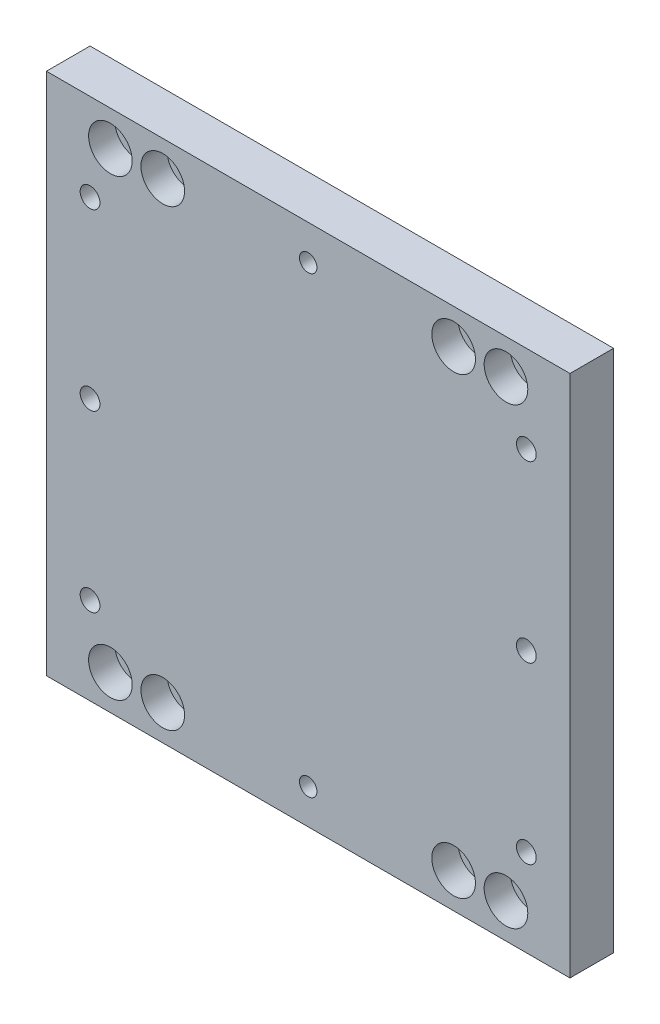
ISO-10303-21;
HEADER;
FILE_DESCRIPTION(('STEP AP214'),'2;1');
FILE_NAME('part.step','',(''),(''),'','','');
FILE_SCHEMA(('AUTOMOTIVE_DESIGN { 1 0 10303 214 1 1 1 1 }'));
ENDSEC;
DATA;
#1=APPLICATION_CONTEXT('core data for automotive mechanical design processes');
#2=APPLICATION_PROTOCOL_DEFINITION('international standard','automotive_design',2000,#1);
#3=PRODUCT_CONTEXT('',#1,'mechanical');
#4=PRODUCT('Part','Part','',(#3));
#5=PRODUCT_RELATED_PRODUCT_CATEGORY('part','',(#4));
#6=PRODUCT_DEFINITION_FORMATION('','',#4);
#7=PRODUCT_DEFINITION_CONTEXT('part definition',#1,'design');
#8=PRODUCT_DEFINITION('design','',#6,#7);
#9=PRODUCT_DEFINITION_SHAPE('','',#8);
#10=(LENGTH_UNIT() NAMED_UNIT(*) SI_UNIT(.MILLI.,.METRE.));
#11=(NAMED_UNIT(*) PLANE_ANGLE_UNIT() SI_UNIT($,.RADIAN.));
#12=(NAMED_UNIT(*) SI_UNIT($,.STERADIAN.) SOLID_ANGLE_UNIT());
#13=UNCERTAINTY_MEASURE_WITH_UNIT(LENGTH_MEASURE(1.E-05),#10,'distance_accuracy_value','');
#14=(GEOMETRIC_REPRESENTATION_CONTEXT(3) GLOBAL_UNCERTAINTY_ASSIGNED_CONTEXT((#13)) GLOBAL_UNIT_ASSIGNED_CONTEXT((#10,
#11,#12)) REPRESENTATION_CONTEXT('',''));
#15=CARTESIAN_POINT('',(0.,0.,0.));
#16=DIRECTION('',(0.,0.,1.));
#17=DIRECTION('',(1.,0.,0.));
#18=AXIS2_PLACEMENT_3D('',#15,#16,#17);
#19=CARTESIAN_POINT('',(-90.,90.,15.));
#20=DIRECTION('',(1.,0.,0.));
#21=DIRECTION('',(0.,1.,0.));
#22=AXIS2_PLACEMENT_3D('',#19,#20,#21);
#23=PLANE('',#22);
#24=DIRECTION('',(0.,-1.,0.));
#25=VECTOR('',#24,1.);
#26=CARTESIAN_POINT('',(-90.,90.,0.));
#27=LINE('',#26,#25);
#28=CARTESIAN_POINT('',(-90.,90.,0.));
#29=VERTEX_POINT('',#28);
#30=CARTESIAN_POINT('',(-90.,-90.,0.));
#31=VERTEX_POINT('',#30);
#32=EDGE_CURVE('E102',#29,#31,#27,.T.);
#33=ORIENTED_EDGE('',*,*,#32,.T.);
#34=DIRECTION('',(0.,0.,-1.));
#35=VECTOR('',#34,1.);
#36=CARTESIAN_POINT('',(-90.,-90.,15.));
#37=LINE('',#36,#35);
#38=CARTESIAN_POINT('',(-90.,-90.,15.));
#39=VERTEX_POINT('',#38);
#40=EDGE_CURVE('E11',#39,#31,#37,.T.);
#41=ORIENTED_EDGE('',*,*,#40,.F.);
#42=DIRECTION('',(0.,-1.,0.));
#43=VECTOR('',#42,1.);
#44=CARTESIAN_POINT('',(-90.,90.,15.));
#45=LINE('',#44,#43);
#46=CARTESIAN_POINT('',(-90.,90.,15.));
#47=VERTEX_POINT('',#46);
#48=EDGE_CURVE('E89',#47,#39,#45,.T.);
#49=ORIENTED_EDGE('',*,*,#48,.F.);
#50=DIRECTION('',(0.,0.,-1.));
#51=VECTOR('',#50,1.);
#52=CARTESIAN_POINT('',(-90.,90.,15.));
#53=LINE('',#52,#51);
#54=EDGE_CURVE('E98',#47,#29,#53,.T.);
#55=ORIENTED_EDGE('',*,*,#54,.T.);
#56=EDGE_LOOP('',(#33,#41,#49,#55));
#57=FACE_BOUND('',#56,.T.);
#58=ADVANCED_FACE('F36',(#57),#23,.F.);
#59=CARTESIAN_POINT('',(-90.,-90.,15.));
#60=DIRECTION('',(0.,1.,0.));
#61=DIRECTION('',(0.,0.,1.));
#62=AXIS2_PLACEMENT_3D('',#59,#60,#61);
#63=PLANE('',#62);
#64=DIRECTION('',(1.,0.,0.));
#65=VECTOR('',#64,1.);
#66=CARTESIAN_POINT('',(-90.,-90.,0.));
#67=LINE('',#66,#65);
#68=CARTESIAN_POINT('',(90.,-90.,0.));
#69=VERTEX_POINT('',#68);
#70=EDGE_CURVE('E93',#31,#69,#67,.T.);
#71=ORIENTED_EDGE('',*,*,#70,.T.);
#72=DIRECTION('',(0.,0.,-1.));
#73=VECTOR('',#72,1.);
#74=CARTESIAN_POINT('',(90.,-90.,15.));
#75=LINE('',#74,#73);
#76=CARTESIAN_POINT('',(90.,-90.,15.));
#77=VERTEX_POINT('',#76);
#78=EDGE_CURVE('E45',#77,#69,#75,.T.);
#79=ORIENTED_EDGE('',*,*,#78,.F.);
#80=DIRECTION('',(1.,0.,0.));
#81=VECTOR('',#80,1.);
#82=CARTESIAN_POINT('',(-90.,-90.,15.));
#83=LINE('',#82,#81);
#84=EDGE_CURVE('E84',#39,#77,#83,.T.);
#85=ORIENTED_EDGE('',*,*,#84,.F.);
#86=ORIENTED_EDGE('',*,*,#40,.T.);
#87=EDGE_LOOP('',(#71,#79,#85,#86));
#88=FACE_BOUND('',#87,.T.);
#89=ADVANCED_FACE('F92',(#88),#63,.F.);
#90=CARTESIAN_POINT('',(90.,90.,15.));
#91=DIRECTION('',(-1.,0.,0.));
#92=DIRECTION('',(0.,-1.,0.));
#93=AXIS2_PLACEMENT_3D('',#90,#91,#92);
#94=PLANE('',#93);
#95=DIRECTION('',(0.,1.,0.));
#96=VECTOR('',#95,1.);
#97=CARTESIAN_POINT('',(90.,90.,0.));
#98=LINE('',#97,#96);
#99=CARTESIAN_POINT('',(90.,90.,0.));
#100=VERTEX_POINT('',#99);
#101=EDGE_CURVE('E71',#69,#100,#98,.T.);
#102=ORIENTED_EDGE('',*,*,#101,.T.);
#103=DIRECTION('',(0.,0.,-1.));
#104=VECTOR('',#103,1.);
#105=CARTESIAN_POINT('',(90.,90.,15.));
#106=LINE('',#105,#104);
#107=CARTESIAN_POINT('',(90.,90.,15.));
#108=VERTEX_POINT('',#107);
#109=EDGE_CURVE('E94',#108,#100,#106,.T.);
#110=ORIENTED_EDGE('',*,*,#109,.F.);
#111=DIRECTION('',(0.,1.,0.));
#112=VECTOR('',#111,1.);
#113=CARTESIAN_POINT('',(90.,90.,15.));
#114=LINE('',#113,#112);
#115=EDGE_CURVE('E87',#77,#108,#114,.T.);
#116=ORIENTED_EDGE('',*,*,#115,.F.);
#117=ORIENTED_EDGE('',*,*,#78,.T.);
#118=EDGE_LOOP('',(#102,#110,#116,#117));
#119=FACE_BOUND('',#118,.T.);
#120=ADVANCED_FACE('F96',(#119),#94,.F.);
#121=CARTESIAN_POINT('',(-90.,90.,15.));
#122=DIRECTION('',(0.,-1.,0.));
#123=DIRECTION('',(1.,0.,0.));
#124=AXIS2_PLACEMENT_3D('',#121,#122,#123);
#125=PLANE('',#124);
#126=DIRECTION('',(-1.,0.,0.));
#127=VECTOR('',#126,1.);
#128=CARTESIAN_POINT('',(-90.,90.,0.));
#129=LINE('',#128,#127);
#130=EDGE_CURVE('E77',#100,#29,#129,.T.);
#131=ORIENTED_EDGE('',*,*,#130,.T.);
#132=ORIENTED_EDGE('',*,*,#54,.F.);
#133=DIRECTION('',(-1.,0.,0.));
#134=VECTOR('',#133,1.);
#135=CARTESIAN_POINT('',(-90.,90.,15.));
#136=LINE('',#135,#134);
#137=EDGE_CURVE('E54',#108,#47,#136,.T.);
#138=ORIENTED_EDGE('',*,*,#137,.F.);
#139=ORIENTED_EDGE('',*,*,#109,.T.);
#140=EDGE_LOOP('',(#131,#132,#138,#139));
#141=FACE_BOUND('',#140,.T.);
#142=ADVANCED_FACE('F267',(#141),#125,.F.);
#143=CARTESIAN_POINT('',(0.,0.,15.));
#144=DIRECTION('',(0.,0.,1.));
#145=DIRECTION('',(1.,0.,0.));
#146=AXIS2_PLACEMENT_3D('',#143,#144,#145);
#147=PLANE('',#146);
#148=CARTESIAN_POINT('',(-75.,60.,15.));
#149=DIRECTION('',(0.,0.,1.));
#150=DIRECTION('',(1.,0.,0.));
#151=AXIS2_PLACEMENT_3D('',#148,#149,#150);
#152=CIRCLE('',#151,3.39999999999999);
#153=CARTESIAN_POINT('',(-71.6,60.,15.));
#154=VERTEX_POINT('',#153);
#155=EDGE_CURVE('E629',#154,#154,#152,.T.);
#156=ORIENTED_EDGE('',*,*,#155,.F.);
#157=EDGE_LOOP('',(#156));
#158=FACE_BOUND('',#157,.T.);
#159=CARTESIAN_POINT('',(-75.,0.,15.));
#160=DIRECTION('',(0.,0.,1.));
#161=DIRECTION('',(1.,0.,0.));
#162=AXIS2_PLACEMENT_3D('',#159,#160,#161);
#163=CIRCLE('',#162,3.39999999999999);
#164=CARTESIAN_POINT('',(-71.6,0.,15.));
#165=VERTEX_POINT('',#164);
#166=EDGE_CURVE('E633',#165,#165,#163,.T.);
#167=ORIENTED_EDGE('',*,*,#166,.F.);
#168=EDGE_LOOP('',(#167));
#169=FACE_BOUND('',#168,.T.);
#170=CARTESIAN_POINT('',(-75.,-60.,15.));
#171=DIRECTION('',(0.,0.,1.));
#172=DIRECTION('',(1.,0.,0.));
#173=AXIS2_PLACEMENT_3D('',#170,#171,#172);
#174=CIRCLE('',#173,3.39999999999999);
#175=CARTESIAN_POINT('',(-71.6,-60.,15.));
#176=VERTEX_POINT('',#175);
#177=EDGE_CURVE('E131',#176,#176,#174,.T.);
#178=ORIENTED_EDGE('',*,*,#177,.F.);
#179=EDGE_LOOP('',(#178));
#180=FACE_BOUND('',#179,.T.);
#181=CARTESIAN_POINT('',(75.,-60.,15.));
#182=DIRECTION('',(0.,0.,1.));
#183=DIRECTION('',(1.,0.,0.));
#184=AXIS2_PLACEMENT_3D('',#181,#182,#183);
#185=CIRCLE('',#184,3.39999999999999);
#186=CARTESIAN_POINT('',(78.4,-60.,15.));
#187=VERTEX_POINT('',#186);
#188=EDGE_CURVE('E121',#187,#187,#185,.T.);
#189=ORIENTED_EDGE('',*,*,#188,.F.);
#190=EDGE_LOOP('',(#189));
#191=FACE_BOUND('',#190,.T.);
#192=CARTESIAN_POINT('',(75.,0.,15.));
#193=DIRECTION('',(0.,0.,1.));
#194=DIRECTION('',(1.,0.,0.));
#195=AXIS2_PLACEMENT_3D('',#192,#193,#194);
#196=CIRCLE('',#195,3.39999999999999);
#197=CARTESIAN_POINT('',(78.4,0.,15.));
#198=VERTEX_POINT('',#197);
#199=EDGE_CURVE('E118',#198,#198,#196,.T.);
#200=ORIENTED_EDGE('',*,*,#199,.F.);
#201=EDGE_LOOP('',(#200));
#202=FACE_BOUND('',#201,.T.);
#203=CARTESIAN_POINT('',(75.,60.,15.));
#204=DIRECTION('',(0.,0.,1.));
#205=DIRECTION('',(1.,0.,0.));
#206=AXIS2_PLACEMENT_3D('',#203,#204,#205);
#207=CIRCLE('',#206,3.39999999999999);
#208=CARTESIAN_POINT('',(78.4,60.,15.));
#209=VERTEX_POINT('',#208);
#210=EDGE_CURVE('E115',#209,#209,#207,.T.);
#211=ORIENTED_EDGE('',*,*,#210,.F.);
#212=EDGE_LOOP('',(#211));
#213=FACE_BOUND('',#212,.T.);
#214=CARTESIAN_POINT('',(0.,78.,15.));
#215=DIRECTION('',(0.,0.,1.));
#216=DIRECTION('',(1.,0.,0.));
#217=AXIS2_PLACEMENT_3D('',#214,#215,#216);
#218=CIRCLE('',#217,2.99999999999999);
#219=CARTESIAN_POINT('',(2.99999999999999,78.,15.));
#220=VERTEX_POINT('',#219);
#221=EDGE_CURVE('E114',#220,#220,#218,.T.);
#222=ORIENTED_EDGE('',*,*,#221,.F.);
#223=EDGE_LOOP('',(#222));
#224=FACE_BOUND('',#223,.T.);
#225=CARTESIAN_POINT('',(0.,-78.,15.));
#226=DIRECTION('',(0.,0.,1.));
#227=DIRECTION('',(1.,0.,0.));
#228=AXIS2_PLACEMENT_3D('',#225,#226,#227);
#229=CIRCLE('',#228,2.99999999999999);
#230=CARTESIAN_POINT('',(3.,-78.,15.));
#231=VERTEX_POINT('',#230);
#232=EDGE_CURVE('E142',#231,#231,#229,.T.);
#233=ORIENTED_EDGE('',*,*,#232,.F.);
#234=EDGE_LOOP('',(#233));
#235=FACE_BOUND('',#234,.T.);
#236=CARTESIAN_POINT('',(-68.,-78.,15.));
#237=DIRECTION('',(0.,0.,1.));
#238=DIRECTION('',(1.,0.,0.));
#239=AXIS2_PLACEMENT_3D('',#236,#237,#238);
#240=CIRCLE('',#239,7.5);
#241=CARTESIAN_POINT('',(-60.5,-78.,15.));
#242=VERTEX_POINT('',#241);
#243=EDGE_CURVE('E148',#242,#242,#240,.T.);
#244=ORIENTED_EDGE('',*,*,#243,.F.);
#245=EDGE_LOOP('',(#244));
#246=FACE_BOUND('',#245,.T.);
#247=CARTESIAN_POINT('',(-50.,-78.,15.));
#248=DIRECTION('',(0.,0.,1.));
#249=DIRECTION('',(1.,0.,0.));
#250=AXIS2_PLACEMENT_3D('',#247,#248,#249);
#251=CIRCLE('',#250,7.5);
#252=CARTESIAN_POINT('',(-42.5,-78.,15.));
#253=VERTEX_POINT('',#252);
#254=EDGE_CURVE('E160',#253,#253,#251,.T.);
#255=ORIENTED_EDGE('',*,*,#254,.F.);
#256=EDGE_LOOP('',(#255));
#257=FACE_BOUND('',#256,.T.);
#258=CARTESIAN_POINT('',(50.,-78.,15.));
#259=DIRECTION('',(0.,0.,1.));
#260=DIRECTION('',(1.,0.,0.));
#261=AXIS2_PLACEMENT_3D('',#258,#259,#260);
#262=CIRCLE('',#261,7.5);
#263=CARTESIAN_POINT('',(57.5,-78.,15.));
#264=VERTEX_POINT('',#263);
#265=EDGE_CURVE('E172',#264,#264,#262,.T.);
#266=ORIENTED_EDGE('',*,*,#265,.F.);
#267=EDGE_LOOP('',(#266));
#268=FACE_BOUND('',#267,.T.);
#269=CARTESIAN_POINT('',(68.,-78.,15.));
#270=DIRECTION('',(0.,0.,1.));
#271=DIRECTION('',(1.,0.,0.));
#272=AXIS2_PLACEMENT_3D('',#269,#270,#271);
#273=CIRCLE('',#272,7.49999999999999);
#274=CARTESIAN_POINT('',(75.5,-78.,15.));
#275=VERTEX_POINT('',#274);
#276=EDGE_CURVE('E184',#275,#275,#273,.T.);
#277=ORIENTED_EDGE('',*,*,#276,.F.);
#278=EDGE_LOOP('',(#277));
#279=FACE_BOUND('',#278,.T.);
#280=CARTESIAN_POINT('',(68.,78.,15.));
#281=DIRECTION('',(0.,0.,1.));
#282=DIRECTION('',(1.,0.,0.));
#283=AXIS2_PLACEMENT_3D('',#280,#281,#282);
#284=CIRCLE('',#283,7.49999999999999);
#285=CARTESIAN_POINT('',(75.5,78.,15.));
#286=VERTEX_POINT('',#285);
#287=EDGE_CURVE('E196',#286,#286,#284,.T.);
#288=ORIENTED_EDGE('',*,*,#287,.F.);
#289=EDGE_LOOP('',(#288));
#290=FACE_BOUND('',#289,.T.);
#291=CARTESIAN_POINT('',(50.,78.,15.));
#292=DIRECTION('',(0.,0.,1.));
#293=DIRECTION('',(1.,0.,0.));
#294=AXIS2_PLACEMENT_3D('',#291,#292,#293);
#295=CIRCLE('',#294,7.5);
#296=CARTESIAN_POINT('',(57.5,78.,15.));
#297=VERTEX_POINT('',#296);
#298=EDGE_CURVE('E208',#297,#297,#295,.T.);
#299=ORIENTED_EDGE('',*,*,#298,.F.);
#300=EDGE_LOOP('',(#299));
#301=FACE_BOUND('',#300,.T.);
#302=CARTESIAN_POINT('',(-50.,78.,15.));
#303=DIRECTION('',(0.,0.,1.));
#304=DIRECTION('',(1.,0.,0.));
#305=AXIS2_PLACEMENT_3D('',#302,#303,#304);
#306=CIRCLE('',#305,7.5);
#307=CARTESIAN_POINT('',(-42.5,78.,15.));
#308=VERTEX_POINT('',#307);
#309=EDGE_CURVE('E220',#308,#308,#306,.T.);
#310=ORIENTED_EDGE('',*,*,#309,.F.);
#311=EDGE_LOOP('',(#310));
#312=FACE_BOUND('',#311,.T.);
#313=CARTESIAN_POINT('',(-68.,78.,15.));
#314=DIRECTION('',(0.,0.,1.));
#315=DIRECTION('',(1.,0.,0.));
#316=AXIS2_PLACEMENT_3D('',#313,#314,#315);
#317=CIRCLE('',#316,7.5);
#318=CARTESIAN_POINT('',(-60.5,78.,15.));
#319=VERTEX_POINT('',#318);
#320=EDGE_CURVE('E232',#319,#319,#317,.T.);
#321=ORIENTED_EDGE('',*,*,#320,.F.);
#322=EDGE_LOOP('',(#321));
#323=FACE_BOUND('',#322,.T.);
#324=ORIENTED_EDGE('',*,*,#48,.T.);
#325=ORIENTED_EDGE('',*,*,#84,.T.);
#326=ORIENTED_EDGE('',*,*,#115,.T.);
#327=ORIENTED_EDGE('',*,*,#137,.T.);
#328=EDGE_LOOP('',(#324,#325,#326,#327));
#329=FACE_BOUND('',#328,.T.);
#330=ADVANCED_FACE('F85',(#158,#169,#180,#191,#202,#213,#224,#235,#246,#257,#268,#279,#290,#301,
#312,#323,#329),#147,.T.);
#331=CARTESIAN_POINT('',(0.,0.,0.));
#332=DIRECTION('',(0.,0.,1.));
#333=DIRECTION('',(1.,0.,0.));
#334=AXIS2_PLACEMENT_3D('',#331,#332,#333);
#335=PLANE('',#334);
#336=CARTESIAN_POINT('',(-75.,60.,0.));
#337=DIRECTION('',(0.,0.,1.));
#338=DIRECTION('',(1.,0.,0.));
#339=AXIS2_PLACEMENT_3D('',#336,#337,#338);
#340=CIRCLE('',#339,3.39999999999999);
#341=CARTESIAN_POINT('',(-71.6,60.,0.));
#342=VERTEX_POINT('',#341);
#343=EDGE_CURVE('E632',#342,#342,#340,.T.);
#344=ORIENTED_EDGE('',*,*,#343,.T.);
#345=EDGE_LOOP('',(#344));
#346=FACE_BOUND('',#345,.T.);
#347=CARTESIAN_POINT('',(-75.,0.,0.));
#348=DIRECTION('',(0.,0.,1.));
#349=DIRECTION('',(1.,0.,0.));
#350=AXIS2_PLACEMENT_3D('',#347,#348,#349);
#351=CIRCLE('',#350,3.39999999999999);
#352=CARTESIAN_POINT('',(-71.6,0.,0.));
#353=VERTEX_POINT('',#352);
#354=EDGE_CURVE('E636',#353,#353,#351,.T.);
#355=ORIENTED_EDGE('',*,*,#354,.T.);
#356=EDGE_LOOP('',(#355));
#357=FACE_BOUND('',#356,.T.);
#358=CARTESIAN_POINT('',(-75.,-60.,0.));
#359=DIRECTION('',(0.,0.,1.));
#360=DIRECTION('',(1.,0.,0.));
#361=AXIS2_PLACEMENT_3D('',#358,#359,#360);
#362=CIRCLE('',#361,3.39999999999999);
#363=CARTESIAN_POINT('',(-71.6,-60.,0.));
#364=VERTEX_POINT('',#363);
#365=EDGE_CURVE('E39',#364,#364,#362,.T.);
#366=ORIENTED_EDGE('',*,*,#365,.T.);
#367=EDGE_LOOP('',(#366));
#368=FACE_BOUND('',#367,.T.);
#369=CARTESIAN_POINT('',(75.,-60.,0.));
#370=DIRECTION('',(0.,0.,1.));
#371=DIRECTION('',(1.,0.,0.));
#372=AXIS2_PLACEMENT_3D('',#369,#370,#371);
#373=CIRCLE('',#372,3.39999999999999);
#374=CARTESIAN_POINT('',(78.4,-60.,0.));
#375=VERTEX_POINT('',#374);
#376=EDGE_CURVE('E119',#375,#375,#373,.T.);
#377=ORIENTED_EDGE('',*,*,#376,.T.);
#378=EDGE_LOOP('',(#377));
#379=FACE_BOUND('',#378,.T.);
#380=CARTESIAN_POINT('',(75.,0.,0.));
#381=DIRECTION('',(0.,0.,1.));
#382=DIRECTION('',(1.,0.,0.));
#383=AXIS2_PLACEMENT_3D('',#380,#381,#382);
#384=CIRCLE('',#383,3.39999999999999);
#385=CARTESIAN_POINT('',(78.4,0.,0.));
#386=VERTEX_POINT('',#385);
#387=EDGE_CURVE('E116',#386,#386,#384,.T.);
#388=ORIENTED_EDGE('',*,*,#387,.T.);
#389=EDGE_LOOP('',(#388));
#390=FACE_BOUND('',#389,.T.);
#391=CARTESIAN_POINT('',(75.,60.,0.));
#392=DIRECTION('',(0.,0.,1.));
#393=DIRECTION('',(1.,0.,0.));
#394=AXIS2_PLACEMENT_3D('',#391,#392,#393);
#395=CIRCLE('',#394,3.39999999999999);
#396=CARTESIAN_POINT('',(78.4,60.,0.));
#397=VERTEX_POINT('',#396);
#398=EDGE_CURVE('E111',#397,#397,#395,.T.);
#399=ORIENTED_EDGE('',*,*,#398,.T.);
#400=EDGE_LOOP('',(#399));
#401=FACE_BOUND('',#400,.T.);
#402=CARTESIAN_POINT('',(0.,78.,0.));
#403=DIRECTION('',(0.,0.,1.));
#404=DIRECTION('',(1.,0.,0.));
#405=AXIS2_PLACEMENT_3D('',#402,#403,#404);
#406=CIRCLE('',#405,3.);
#407=CARTESIAN_POINT('',(3.,78.,0.));
#408=VERTEX_POINT('',#407);
#409=EDGE_CURVE('E139',#408,#408,#406,.T.);
#410=ORIENTED_EDGE('',*,*,#409,.T.);
#411=EDGE_LOOP('',(#410));
#412=FACE_BOUND('',#411,.T.);
#413=CARTESIAN_POINT('',(0.,-78.,0.));
#414=DIRECTION('',(0.,0.,1.));
#415=DIRECTION('',(1.,0.,0.));
#416=AXIS2_PLACEMENT_3D('',#413,#414,#415);
#417=CIRCLE('',#416,3.);
#418=CARTESIAN_POINT('',(3.00000000000001,-78.,0.));
#419=VERTEX_POINT('',#418);
#420=EDGE_CURVE('E145',#419,#419,#417,.T.);
#421=ORIENTED_EDGE('',*,*,#420,.T.);
#422=EDGE_LOOP('',(#421));
#423=FACE_BOUND('',#422,.T.);
#424=CARTESIAN_POINT('',(-68.,-78.,0.));
#425=DIRECTION('',(0.,0.,1.));
#426=DIRECTION('',(1.,0.,0.));
#427=AXIS2_PLACEMENT_3D('',#424,#425,#426);
#428=CIRCLE('',#427,4.5);
#429=CARTESIAN_POINT('',(-63.5,-78.,0.));
#430=VERTEX_POINT('',#429);
#431=EDGE_CURVE('E157',#430,#430,#428,.T.);
#432=ORIENTED_EDGE('',*,*,#431,.T.);
#433=EDGE_LOOP('',(#432));
#434=FACE_BOUND('',#433,.T.);
#435=CARTESIAN_POINT('',(-50.,-78.,0.));
#436=DIRECTION('',(0.,0.,1.));
#437=DIRECTION('',(1.,0.,0.));
#438=AXIS2_PLACEMENT_3D('',#435,#436,#437);
#439=CIRCLE('',#438,4.5);
#440=CARTESIAN_POINT('',(-45.5,-78.,0.));
#441=VERTEX_POINT('',#440);
#442=EDGE_CURVE('E169',#441,#441,#439,.T.);
#443=ORIENTED_EDGE('',*,*,#442,.T.);
#444=EDGE_LOOP('',(#443));
#445=FACE_BOUND('',#444,.T.);
#446=CARTESIAN_POINT('',(50.,-78.,0.));
#447=DIRECTION('',(0.,0.,1.));
#448=DIRECTION('',(1.,0.,0.));
#449=AXIS2_PLACEMENT_3D('',#446,#447,#448);
#450=CIRCLE('',#449,4.5);
#451=CARTESIAN_POINT('',(54.5,-78.,0.));
#452=VERTEX_POINT('',#451);
#453=EDGE_CURVE('E181',#452,#452,#450,.T.);
#454=ORIENTED_EDGE('',*,*,#453,.T.);
#455=EDGE_LOOP('',(#454));
#456=FACE_BOUND('',#455,.T.);
#457=CARTESIAN_POINT('',(68.,-78.,0.));
#458=DIRECTION('',(0.,0.,1.));
#459=DIRECTION('',(1.,0.,0.));
#460=AXIS2_PLACEMENT_3D('',#457,#458,#459);
#461=CIRCLE('',#460,4.49999999999999);
#462=CARTESIAN_POINT('',(72.5,-78.,0.));
#463=VERTEX_POINT('',#462);
#464=EDGE_CURVE('E193',#463,#463,#461,.T.);
#465=ORIENTED_EDGE('',*,*,#464,.T.);
#466=EDGE_LOOP('',(#465));
#467=FACE_BOUND('',#466,.T.);
#468=CARTESIAN_POINT('',(68.,78.,0.));
#469=DIRECTION('',(0.,0.,1.));
#470=DIRECTION('',(1.,0.,0.));
#471=AXIS2_PLACEMENT_3D('',#468,#469,#470);
#472=CIRCLE('',#471,4.5);
#473=CARTESIAN_POINT('',(72.5,78.,0.));
#474=VERTEX_POINT('',#473);
#475=EDGE_CURVE('E205',#474,#474,#472,.T.);
#476=ORIENTED_EDGE('',*,*,#475,.T.);
#477=EDGE_LOOP('',(#476));
#478=FACE_BOUND('',#477,.T.);
#479=CARTESIAN_POINT('',(50.,78.,0.));
#480=DIRECTION('',(0.,0.,1.));
#481=DIRECTION('',(1.,0.,0.));
#482=AXIS2_PLACEMENT_3D('',#479,#480,#481);
#483=CIRCLE('',#482,4.5);
#484=CARTESIAN_POINT('',(54.5,78.,0.));
#485=VERTEX_POINT('',#484);
#486=EDGE_CURVE('E217',#485,#485,#483,.T.);
#487=ORIENTED_EDGE('',*,*,#486,.T.);
#488=EDGE_LOOP('',(#487));
#489=FACE_BOUND('',#488,.T.);
#490=CARTESIAN_POINT('',(-50.,78.,0.));
#491=DIRECTION('',(0.,0.,1.));
#492=DIRECTION('',(1.,0.,0.));
#493=AXIS2_PLACEMENT_3D('',#490,#491,#492);
#494=CIRCLE('',#493,4.5);
#495=CARTESIAN_POINT('',(-45.5,78.,0.));
#496=VERTEX_POINT('',#495);
#497=EDGE_CURVE('E229',#496,#496,#494,.T.);
#498=ORIENTED_EDGE('',*,*,#497,.T.);
#499=EDGE_LOOP('',(#498));
#500=FACE_BOUND('',#499,.T.);
#501=CARTESIAN_POINT('',(-68.,78.,0.));
#502=DIRECTION('',(0.,0.,1.));
#503=DIRECTION('',(1.,0.,0.));
#504=AXIS2_PLACEMENT_3D('',#501,#502,#503);
#505=CIRCLE('',#504,4.5);
#506=CARTESIAN_POINT('',(-63.5,78.,0.));
#507=VERTEX_POINT('',#506);
#508=EDGE_CURVE('E105',#507,#507,#505,.T.);
#509=ORIENTED_EDGE('',*,*,#508,.T.);
#510=EDGE_LOOP('',(#509));
#511=FACE_BOUND('',#510,.T.);
#512=ORIENTED_EDGE('',*,*,#32,.F.);
#513=ORIENTED_EDGE('',*,*,#130,.F.);
#514=ORIENTED_EDGE('',*,*,#101,.F.);
#515=ORIENTED_EDGE('',*,*,#70,.F.);
#516=EDGE_LOOP('',(#512,#513,#514,#515));
#517=FACE_BOUND('',#516,.T.);
#518=ADVANCED_FACE('F244',(#346,#357,#368,#379,#390,#401,#412,#423,#434,#445,#456,#467,#478,
#489,#500,#511,#517),#335,.F.);
#519=CARTESIAN_POINT('',(-68.,78.,15.));
#520=DIRECTION('',(0.,0.,1.));
#521=DIRECTION('',(1.,0.,0.));
#522=AXIS2_PLACEMENT_3D('',#519,#520,#521);
#523=CYLINDRICAL_SURFACE('',#522,4.5);
#524=ORIENTED_EDGE('',*,*,#508,.F.);
#525=EDGE_LOOP('',(#524));
#526=FACE_BOUND('',#525,.T.);
#527=CARTESIAN_POINT('',(-68.,78.,6.));
#528=DIRECTION('',(0.,0.,1.));
#529=DIRECTION('',(1.,0.,0.));
#530=AXIS2_PLACEMENT_3D('',#527,#528,#529);
#531=CIRCLE('',#530,4.5);
#532=CARTESIAN_POINT('',(-63.5,78.,6.));
#533=VERTEX_POINT('',#532);
#534=EDGE_CURVE('E238',#533,#533,#531,.T.);
#535=ORIENTED_EDGE('',*,*,#534,.T.);
#536=EDGE_LOOP('',(#535));
#537=FACE_BOUND('',#536,.T.);
#538=ADVANCED_FACE('F247',(#526,#537),#523,.F.);
#539=CARTESIAN_POINT('',(-63.5,78.,6.));
#540=DIRECTION('',(0.,0.,-1.));
#541=DIRECTION('',(-1.,0.,0.));
#542=AXIS2_PLACEMENT_3D('',#539,#540,#541);
#543=PLANE('',#542);
#544=ORIENTED_EDGE('',*,*,#534,.F.);
#545=EDGE_LOOP('',(#544));
#546=FACE_BOUND('',#545,.T.);
#547=CARTESIAN_POINT('',(-68.,78.,6.));
#548=DIRECTION('',(0.,0.,1.));
#549=DIRECTION('',(1.,0.,0.));
#550=AXIS2_PLACEMENT_3D('',#547,#548,#549);
#551=CIRCLE('',#550,7.5);
#552=CARTESIAN_POINT('',(-60.5,78.,6.));
#553=VERTEX_POINT('',#552);
#554=EDGE_CURVE('E235',#553,#553,#551,.T.);
#555=ORIENTED_EDGE('',*,*,#554,.T.);
#556=EDGE_LOOP('',(#555));
#557=FACE_BOUND('',#556,.T.);
#558=ADVANCED_FACE('F250',(#546,#557),#543,.F.);
#559=CARTESIAN_POINT('',(-68.,78.,15.));
#560=DIRECTION('',(0.,0.,1.));
#561=DIRECTION('',(1.,0.,0.));
#562=AXIS2_PLACEMENT_3D('',#559,#560,#561);
#563=CYLINDRICAL_SURFACE('',#562,7.5);
#564=ORIENTED_EDGE('',*,*,#554,.F.);
#565=EDGE_LOOP('',(#564));
#566=FACE_BOUND('',#565,.T.);
#567=ORIENTED_EDGE('',*,*,#320,.T.);
#568=EDGE_LOOP('',(#567));
#569=FACE_BOUND('',#568,.T.);
#570=ADVANCED_FACE('F256',(#566,#569),#563,.F.);
#571=CARTESIAN_POINT('',(-50.,78.,15.));
#572=DIRECTION('',(0.,0.,1.));
#573=DIRECTION('',(1.,0.,0.));
#574=AXIS2_PLACEMENT_3D('',#571,#572,#573);
#575=CYLINDRICAL_SURFACE('',#574,4.5);
#576=ORIENTED_EDGE('',*,*,#497,.F.);
#577=EDGE_LOOP('',(#576));
#578=FACE_BOUND('',#577,.T.);
#579=CARTESIAN_POINT('',(-50.,78.,6.));
#580=DIRECTION('',(0.,0.,1.));
#581=DIRECTION('',(1.,0.,0.));
#582=AXIS2_PLACEMENT_3D('',#579,#580,#581);
#583=CIRCLE('',#582,4.5);
#584=CARTESIAN_POINT('',(-45.5,78.,6.));
#585=VERTEX_POINT('',#584);
#586=EDGE_CURVE('E226',#585,#585,#583,.T.);
#587=ORIENTED_EDGE('',*,*,#586,.T.);
#588=EDGE_LOOP('',(#587));
#589=FACE_BOUND('',#588,.T.);
#590=ADVANCED_FACE('F262',(#578,#589),#575,.F.);
#591=CARTESIAN_POINT('',(-45.5,78.,6.));
#592=DIRECTION('',(0.,0.,-1.));
#593=DIRECTION('',(-1.,0.,0.));
#594=AXIS2_PLACEMENT_3D('',#591,#592,#593);
#595=PLANE('',#594);
#596=ORIENTED_EDGE('',*,*,#586,.F.);
#597=EDGE_LOOP('',(#596));
#598=FACE_BOUND('',#597,.T.);
#599=CARTESIAN_POINT('',(-50.,78.,6.));
#600=DIRECTION('',(0.,0.,1.));
#601=DIRECTION('',(1.,0.,0.));
#602=AXIS2_PLACEMENT_3D('',#599,#600,#601);
#603=CIRCLE('',#602,7.5);
#604=CARTESIAN_POINT('',(-42.5,78.,6.));
#605=VERTEX_POINT('',#604);
#606=EDGE_CURVE('E223',#605,#605,#603,.T.);
#607=ORIENTED_EDGE('',*,*,#606,.T.);
#608=EDGE_LOOP('',(#607));
#609=FACE_BOUND('',#608,.T.);
#610=ADVANCED_FACE('F324',(#598,#609),#595,.F.);
#611=CARTESIAN_POINT('',(-50.,78.,15.));
#612=DIRECTION('',(0.,0.,1.));
#613=DIRECTION('',(1.,0.,0.));
#614=AXIS2_PLACEMENT_3D('',#611,#612,#613);
#615=CYLINDRICAL_SURFACE('',#614,7.5);
#616=ORIENTED_EDGE('',*,*,#606,.F.);
#617=EDGE_LOOP('',(#616));
#618=FACE_BOUND('',#617,.T.);
#619=ORIENTED_EDGE('',*,*,#309,.T.);
#620=EDGE_LOOP('',(#619));
#621=FACE_BOUND('',#620,.T.);
#622=ADVANCED_FACE('F334',(#618,#621),#615,.F.);
#623=CARTESIAN_POINT('',(50.,78.,15.));
#624=DIRECTION('',(0.,0.,1.));
#625=DIRECTION('',(1.,0.,0.));
#626=AXIS2_PLACEMENT_3D('',#623,#624,#625);
#627=CYLINDRICAL_SURFACE('',#626,4.5);
#628=ORIENTED_EDGE('',*,*,#486,.F.);
#629=EDGE_LOOP('',(#628));
#630=FACE_BOUND('',#629,.T.);
#631=CARTESIAN_POINT('',(50.,78.,6.));
#632=DIRECTION('',(0.,0.,1.));
#633=DIRECTION('',(1.,0.,0.));
#634=AXIS2_PLACEMENT_3D('',#631,#632,#633);
#635=CIRCLE('',#634,4.5);
#636=CARTESIAN_POINT('',(54.5,78.,6.));
#637=VERTEX_POINT('',#636);
#638=EDGE_CURVE('E214',#637,#637,#635,.T.);
#639=ORIENTED_EDGE('',*,*,#638,.T.);
#640=EDGE_LOOP('',(#639));
#641=FACE_BOUND('',#640,.T.);
#642=ADVANCED_FACE('F344',(#630,#641),#627,.F.);
#643=CARTESIAN_POINT('',(54.5,78.,6.));
#644=DIRECTION('',(0.,0.,-1.));
#645=DIRECTION('',(-1.,0.,0.));
#646=AXIS2_PLACEMENT_3D('',#643,#644,#645);
#647=PLANE('',#646);
#648=ORIENTED_EDGE('',*,*,#638,.F.);
#649=EDGE_LOOP('',(#648));
#650=FACE_BOUND('',#649,.T.);
#651=CARTESIAN_POINT('',(50.,78.,6.));
#652=DIRECTION('',(0.,0.,1.));
#653=DIRECTION('',(1.,0.,0.));
#654=AXIS2_PLACEMENT_3D('',#651,#652,#653);
#655=CIRCLE('',#654,7.5);
#656=CARTESIAN_POINT('',(57.5,78.,6.));
#657=VERTEX_POINT('',#656);
#658=EDGE_CURVE('E211',#657,#657,#655,.T.);
#659=ORIENTED_EDGE('',*,*,#658,.T.);
#660=EDGE_LOOP('',(#659));
#661=FACE_BOUND('',#660,.T.);
#662=ADVANCED_FACE('F354',(#650,#661),#647,.F.);
#663=CARTESIAN_POINT('',(50.,78.,15.));
#664=DIRECTION('',(0.,0.,1.));
#665=DIRECTION('',(1.,0.,0.));
#666=AXIS2_PLACEMENT_3D('',#663,#664,#665);
#667=CYLINDRICAL_SURFACE('',#666,7.5);
#668=ORIENTED_EDGE('',*,*,#658,.F.);
#669=EDGE_LOOP('',(#668));
#670=FACE_BOUND('',#669,.T.);
#671=ORIENTED_EDGE('',*,*,#298,.T.);
#672=EDGE_LOOP('',(#671));
#673=FACE_BOUND('',#672,.T.);
#674=ADVANCED_FACE('F364',(#670,#673),#667,.F.);
#675=CARTESIAN_POINT('',(68.,78.,15.));
#676=DIRECTION('',(0.,0.,1.));
#677=DIRECTION('',(1.,0.,0.));
#678=AXIS2_PLACEMENT_3D('',#675,#676,#677);
#679=CYLINDRICAL_SURFACE('',#678,4.5);
#680=ORIENTED_EDGE('',*,*,#475,.F.);
#681=EDGE_LOOP('',(#680));
#682=FACE_BOUND('',#681,.T.);
#683=CARTESIAN_POINT('',(68.,78.,6.));
#684=DIRECTION('',(0.,0.,1.));
#685=DIRECTION('',(1.,0.,0.));
#686=AXIS2_PLACEMENT_3D('',#683,#684,#685);
#687=CIRCLE('',#686,4.5);
#688=CARTESIAN_POINT('',(72.5,78.,6.));
#689=VERTEX_POINT('',#688);
#690=EDGE_CURVE('E202',#689,#689,#687,.T.);
#691=ORIENTED_EDGE('',*,*,#690,.T.);
#692=EDGE_LOOP('',(#691));
#693=FACE_BOUND('',#692,.T.);
#694=ADVANCED_FACE('F374',(#682,#693),#679,.F.);
#695=CARTESIAN_POINT('',(72.5,78.,6.));
#696=DIRECTION('',(0.,0.,-1.));
#697=DIRECTION('',(-1.,0.,0.));
#698=AXIS2_PLACEMENT_3D('',#695,#696,#697);
#699=PLANE('',#698);
#700=ORIENTED_EDGE('',*,*,#690,.F.);
#701=EDGE_LOOP('',(#700));
#702=FACE_BOUND('',#701,.T.);
#703=CARTESIAN_POINT('',(68.,78.,6.));
#704=DIRECTION('',(0.,0.,1.));
#705=DIRECTION('',(1.,0.,0.));
#706=AXIS2_PLACEMENT_3D('',#703,#704,#705);
#707=CIRCLE('',#706,7.49999999999999);
#708=CARTESIAN_POINT('',(75.5,78.,6.));
#709=VERTEX_POINT('',#708);
#710=EDGE_CURVE('E199',#709,#709,#707,.T.);
#711=ORIENTED_EDGE('',*,*,#710,.T.);
#712=EDGE_LOOP('',(#711));
#713=FACE_BOUND('',#712,.T.);
#714=ADVANCED_FACE('F384',(#702,#713),#699,.F.);
#715=CARTESIAN_POINT('',(68.,78.,15.));
#716=DIRECTION('',(0.,0.,1.));
#717=DIRECTION('',(1.,0.,0.));
#718=AXIS2_PLACEMENT_3D('',#715,#716,#717);
#719=CYLINDRICAL_SURFACE('',#718,7.49999999999999);
#720=ORIENTED_EDGE('',*,*,#710,.F.);
#721=EDGE_LOOP('',(#720));
#722=FACE_BOUND('',#721,.T.);
#723=ORIENTED_EDGE('',*,*,#287,.T.);
#724=EDGE_LOOP('',(#723));
#725=FACE_BOUND('',#724,.T.);
#726=ADVANCED_FACE('F394',(#722,#725),#719,.F.);
#727=CARTESIAN_POINT('',(68.,-78.,15.));
#728=DIRECTION('',(0.,0.,1.));
#729=DIRECTION('',(1.,0.,0.));
#730=AXIS2_PLACEMENT_3D('',#727,#728,#729);
#731=CYLINDRICAL_SURFACE('',#730,4.5);
#732=ORIENTED_EDGE('',*,*,#464,.F.);
#733=EDGE_LOOP('',(#732));
#734=FACE_BOUND('',#733,.T.);
#735=CARTESIAN_POINT('',(68.,-78.,6.));
#736=DIRECTION('',(0.,0.,1.));
#737=DIRECTION('',(1.,0.,0.));
#738=AXIS2_PLACEMENT_3D('',#735,#736,#737);
#739=CIRCLE('',#738,4.5);
#740=CARTESIAN_POINT('',(72.5,-78.,6.));
#741=VERTEX_POINT('',#740);
#742=EDGE_CURVE('E190',#741,#741,#739,.T.);
#743=ORIENTED_EDGE('',*,*,#742,.T.);
#744=EDGE_LOOP('',(#743));
#745=FACE_BOUND('',#744,.T.);
#746=ADVANCED_FACE('F404',(#734,#745),#731,.F.);
#747=CARTESIAN_POINT('',(72.5,-78.,6.));
#748=DIRECTION('',(0.,0.,-1.));
#749=DIRECTION('',(-1.,0.,0.));
#750=AXIS2_PLACEMENT_3D('',#747,#748,#749);
#751=PLANE('',#750);
#752=ORIENTED_EDGE('',*,*,#742,.F.);
#753=EDGE_LOOP('',(#752));
#754=FACE_BOUND('',#753,.T.);
#755=CARTESIAN_POINT('',(68.,-78.,6.));
#756=DIRECTION('',(0.,0.,1.));
#757=DIRECTION('',(1.,0.,0.));
#758=AXIS2_PLACEMENT_3D('',#755,#756,#757);
#759=CIRCLE('',#758,7.49999999999999);
#760=CARTESIAN_POINT('',(75.5,-78.,6.));
#761=VERTEX_POINT('',#760);
#762=EDGE_CURVE('E187',#761,#761,#759,.T.);
#763=ORIENTED_EDGE('',*,*,#762,.T.);
#764=EDGE_LOOP('',(#763));
#765=FACE_BOUND('',#764,.T.);
#766=ADVANCED_FACE('F414',(#754,#765),#751,.F.);
#767=CARTESIAN_POINT('',(68.,-78.,15.));
#768=DIRECTION('',(0.,0.,1.));
#769=DIRECTION('',(1.,0.,0.));
#770=AXIS2_PLACEMENT_3D('',#767,#768,#769);
#771=CYLINDRICAL_SURFACE('',#770,7.49999999999999);
#772=ORIENTED_EDGE('',*,*,#762,.F.);
#773=EDGE_LOOP('',(#772));
#774=FACE_BOUND('',#773,.T.);
#775=ORIENTED_EDGE('',*,*,#276,.T.);
#776=EDGE_LOOP('',(#775));
#777=FACE_BOUND('',#776,.T.);
#778=ADVANCED_FACE('F424',(#774,#777),#771,.F.);
#779=CARTESIAN_POINT('',(50.,-78.,15.));
#780=DIRECTION('',(0.,0.,1.));
#781=DIRECTION('',(1.,0.,0.));
#782=AXIS2_PLACEMENT_3D('',#779,#780,#781);
#783=CYLINDRICAL_SURFACE('',#782,4.5);
#784=ORIENTED_EDGE('',*,*,#453,.F.);
#785=EDGE_LOOP('',(#784));
#786=FACE_BOUND('',#785,.T.);
#787=CARTESIAN_POINT('',(50.,-78.,6.));
#788=DIRECTION('',(0.,0.,1.));
#789=DIRECTION('',(1.,0.,0.));
#790=AXIS2_PLACEMENT_3D('',#787,#788,#789);
#791=CIRCLE('',#790,4.5);
#792=CARTESIAN_POINT('',(54.5,-78.,6.));
#793=VERTEX_POINT('',#792);
#794=EDGE_CURVE('E178',#793,#793,#791,.T.);
#795=ORIENTED_EDGE('',*,*,#794,.T.);
#796=EDGE_LOOP('',(#795));
#797=FACE_BOUND('',#796,.T.);
#798=ADVANCED_FACE('F434',(#786,#797),#783,.F.);
#799=CARTESIAN_POINT('',(54.5,-78.,6.));
#800=DIRECTION('',(0.,0.,-1.));
#801=DIRECTION('',(-1.,0.,0.));
#802=AXIS2_PLACEMENT_3D('',#799,#800,#801);
#803=PLANE('',#802);
#804=ORIENTED_EDGE('',*,*,#794,.F.);
#805=EDGE_LOOP('',(#804));
#806=FACE_BOUND('',#805,.T.);
#807=CARTESIAN_POINT('',(50.,-78.,6.));
#808=DIRECTION('',(0.,0.,1.));
#809=DIRECTION('',(1.,0.,0.));
#810=AXIS2_PLACEMENT_3D('',#807,#808,#809);
#811=CIRCLE('',#810,7.5);
#812=CARTESIAN_POINT('',(57.5,-78.,6.));
#813=VERTEX_POINT('',#812);
#814=EDGE_CURVE('E175',#813,#813,#811,.T.);
#815=ORIENTED_EDGE('',*,*,#814,.T.);
#816=EDGE_LOOP('',(#815));
#817=FACE_BOUND('',#816,.T.);
#818=ADVANCED_FACE('F444',(#806,#817),#803,.F.);
#819=CARTESIAN_POINT('',(50.,-78.,15.));
#820=DIRECTION('',(0.,0.,1.));
#821=DIRECTION('',(1.,0.,0.));
#822=AXIS2_PLACEMENT_3D('',#819,#820,#821);
#823=CYLINDRICAL_SURFACE('',#822,7.5);
#824=ORIENTED_EDGE('',*,*,#814,.F.);
#825=EDGE_LOOP('',(#824));
#826=FACE_BOUND('',#825,.T.);
#827=ORIENTED_EDGE('',*,*,#265,.T.);
#828=EDGE_LOOP('',(#827));
#829=FACE_BOUND('',#828,.T.);
#830=ADVANCED_FACE('F454',(#826,#829),#823,.F.);
#831=CARTESIAN_POINT('',(-50.,-78.,15.));
#832=DIRECTION('',(0.,0.,1.));
#833=DIRECTION('',(1.,0.,0.));
#834=AXIS2_PLACEMENT_3D('',#831,#832,#833);
#835=CYLINDRICAL_SURFACE('',#834,4.5);
#836=ORIENTED_EDGE('',*,*,#442,.F.);
#837=EDGE_LOOP('',(#836));
#838=FACE_BOUND('',#837,.T.);
#839=CARTESIAN_POINT('',(-50.,-78.,6.));
#840=DIRECTION('',(0.,0.,1.));
#841=DIRECTION('',(1.,0.,0.));
#842=AXIS2_PLACEMENT_3D('',#839,#840,#841);
#843=CIRCLE('',#842,4.5);
#844=CARTESIAN_POINT('',(-45.5,-78.,6.));
#845=VERTEX_POINT('',#844);
#846=EDGE_CURVE('E166',#845,#845,#843,.T.);
#847=ORIENTED_EDGE('',*,*,#846,.T.);
#848=EDGE_LOOP('',(#847));
#849=FACE_BOUND('',#848,.T.);
#850=ADVANCED_FACE('F464',(#838,#849),#835,.F.);
#851=CARTESIAN_POINT('',(-45.5,-78.,6.));
#852=DIRECTION('',(0.,0.,-1.));
#853=DIRECTION('',(-1.,0.,0.));
#854=AXIS2_PLACEMENT_3D('',#851,#852,#853);
#855=PLANE('',#854);
#856=ORIENTED_EDGE('',*,*,#846,.F.);
#857=EDGE_LOOP('',(#856));
#858=FACE_BOUND('',#857,.T.);
#859=CARTESIAN_POINT('',(-50.,-78.,6.));
#860=DIRECTION('',(0.,0.,1.));
#861=DIRECTION('',(1.,0.,0.));
#862=AXIS2_PLACEMENT_3D('',#859,#860,#861);
#863=CIRCLE('',#862,7.5);
#864=CARTESIAN_POINT('',(-42.5,-78.,6.));
#865=VERTEX_POINT('',#864);
#866=EDGE_CURVE('E163',#865,#865,#863,.T.);
#867=ORIENTED_EDGE('',*,*,#866,.T.);
#868=EDGE_LOOP('',(#867));
#869=FACE_BOUND('',#868,.T.);
#870=ADVANCED_FACE('F474',(#858,#869),#855,.F.);
#871=CARTESIAN_POINT('',(-50.,-78.,15.));
#872=DIRECTION('',(0.,0.,1.));
#873=DIRECTION('',(1.,0.,0.));
#874=AXIS2_PLACEMENT_3D('',#871,#872,#873);
#875=CYLINDRICAL_SURFACE('',#874,7.5);
#876=ORIENTED_EDGE('',*,*,#866,.F.);
#877=EDGE_LOOP('',(#876));
#878=FACE_BOUND('',#877,.T.);
#879=ORIENTED_EDGE('',*,*,#254,.T.);
#880=EDGE_LOOP('',(#879));
#881=FACE_BOUND('',#880,.T.);
#882=ADVANCED_FACE('F484',(#878,#881),#875,.F.);
#883=CARTESIAN_POINT('',(-68.,-78.,15.));
#884=DIRECTION('',(0.,0.,1.));
#885=DIRECTION('',(1.,0.,0.));
#886=AXIS2_PLACEMENT_3D('',#883,#884,#885);
#887=CYLINDRICAL_SURFACE('',#886,4.5);
#888=ORIENTED_EDGE('',*,*,#431,.F.);
#889=EDGE_LOOP('',(#888));
#890=FACE_BOUND('',#889,.T.);
#891=CARTESIAN_POINT('',(-68.,-78.,6.));
#892=DIRECTION('',(0.,0.,1.));
#893=DIRECTION('',(1.,0.,0.));
#894=AXIS2_PLACEMENT_3D('',#891,#892,#893);
#895=CIRCLE('',#894,4.5);
#896=CARTESIAN_POINT('',(-63.5,-78.,6.));
#897=VERTEX_POINT('',#896);
#898=EDGE_CURVE('E154',#897,#897,#895,.T.);
#899=ORIENTED_EDGE('',*,*,#898,.T.);
#900=EDGE_LOOP('',(#899));
#901=FACE_BOUND('',#900,.T.);
#902=ADVANCED_FACE('F494',(#890,#901),#887,.F.);
#903=CARTESIAN_POINT('',(-63.5,-78.,6.));
#904=DIRECTION('',(0.,0.,-1.));
#905=DIRECTION('',(-1.,0.,0.));
#906=AXIS2_PLACEMENT_3D('',#903,#904,#905);
#907=PLANE('',#906);
#908=ORIENTED_EDGE('',*,*,#898,.F.);
#909=EDGE_LOOP('',(#908));
#910=FACE_BOUND('',#909,.T.);
#911=CARTESIAN_POINT('',(-68.,-78.,6.));
#912=DIRECTION('',(0.,0.,1.));
#913=DIRECTION('',(1.,0.,0.));
#914=AXIS2_PLACEMENT_3D('',#911,#912,#913);
#915=CIRCLE('',#914,7.5);
#916=CARTESIAN_POINT('',(-60.5,-78.,6.));
#917=VERTEX_POINT('',#916);
#918=EDGE_CURVE('E151',#917,#917,#915,.T.);
#919=ORIENTED_EDGE('',*,*,#918,.T.);
#920=EDGE_LOOP('',(#919));
#921=FACE_BOUND('',#920,.T.);
#922=ADVANCED_FACE('F504',(#910,#921),#907,.F.);
#923=CARTESIAN_POINT('',(-68.,-78.,15.));
#924=DIRECTION('',(0.,0.,1.));
#925=DIRECTION('',(1.,0.,0.));
#926=AXIS2_PLACEMENT_3D('',#923,#924,#925);
#927=CYLINDRICAL_SURFACE('',#926,7.5);
#928=ORIENTED_EDGE('',*,*,#918,.F.);
#929=EDGE_LOOP('',(#928));
#930=FACE_BOUND('',#929,.T.);
#931=ORIENTED_EDGE('',*,*,#243,.T.);
#932=EDGE_LOOP('',(#931));
#933=FACE_BOUND('',#932,.T.);
#934=ADVANCED_FACE('F514',(#930,#933),#927,.F.);
#935=CARTESIAN_POINT('',(0.,-78.,15.));
#936=DIRECTION('',(0.,0.,1.));
#937=DIRECTION('',(1.,0.,0.));
#938=AXIS2_PLACEMENT_3D('',#935,#936,#937);
#939=CYLINDRICAL_SURFACE('',#938,2.99999999999999);
#940=ORIENTED_EDGE('',*,*,#420,.F.);
#941=EDGE_LOOP('',(#940));
#942=FACE_BOUND('',#941,.T.);
#943=ORIENTED_EDGE('',*,*,#232,.T.);
#944=EDGE_LOOP('',(#943));
#945=FACE_BOUND('',#944,.T.);
#946=ADVANCED_FACE('F524',(#942,#945),#939,.F.);
#947=CARTESIAN_POINT('',(0.,78.,15.));
#948=DIRECTION('',(0.,0.,1.));
#949=DIRECTION('',(1.,0.,0.));
#950=AXIS2_PLACEMENT_3D('',#947,#948,#949);
#951=CYLINDRICAL_SURFACE('',#950,2.99999999999999);
#952=ORIENTED_EDGE('',*,*,#409,.F.);
#953=EDGE_LOOP('',(#952));
#954=FACE_BOUND('',#953,.T.);
#955=ORIENTED_EDGE('',*,*,#221,.T.);
#956=EDGE_LOOP('',(#955));
#957=FACE_BOUND('',#956,.T.);
#958=ADVANCED_FACE('F534',(#954,#957),#951,.F.);
#959=CARTESIAN_POINT('',(75.,60.,15.));
#960=DIRECTION('',(0.,0.,1.));
#961=DIRECTION('',(1.,0.,0.));
#962=AXIS2_PLACEMENT_3D('',#959,#960,#961);
#963=CYLINDRICAL_SURFACE('',#962,3.39999999999999);
#964=ORIENTED_EDGE('',*,*,#210,.T.);
#965=EDGE_LOOP('',(#964));
#966=FACE_BOUND('',#965,.T.);
#967=ORIENTED_EDGE('',*,*,#398,.F.);
#968=EDGE_LOOP('',(#967));
#969=FACE_BOUND('',#968,.T.);
#970=ADVANCED_FACE('F543',(#966,#969),#963,.F.);
#971=CARTESIAN_POINT('',(75.,0.,15.));
#972=DIRECTION('',(0.,0.,1.));
#973=DIRECTION('',(1.,0.,0.));
#974=AXIS2_PLACEMENT_3D('',#971,#972,#973);
#975=CYLINDRICAL_SURFACE('',#974,3.39999999999999);
#976=ORIENTED_EDGE('',*,*,#199,.T.);
#977=EDGE_LOOP('',(#976));
#978=FACE_BOUND('',#977,.T.);
#979=ORIENTED_EDGE('',*,*,#387,.F.);
#980=EDGE_LOOP('',(#979));
#981=FACE_BOUND('',#980,.T.);
#982=ADVANCED_FACE('F563',(#978,#981),#975,.F.);
#983=CARTESIAN_POINT('',(75.,-60.,15.));
#984=DIRECTION('',(0.,0.,1.));
#985=DIRECTION('',(1.,0.,0.));
#986=AXIS2_PLACEMENT_3D('',#983,#984,#985);
#987=CYLINDRICAL_SURFACE('',#986,3.39999999999999);
#988=ORIENTED_EDGE('',*,*,#188,.T.);
#989=EDGE_LOOP('',(#988));
#990=FACE_BOUND('',#989,.T.);
#991=ORIENTED_EDGE('',*,*,#376,.F.);
#992=EDGE_LOOP('',(#991));
#993=FACE_BOUND('',#992,.T.);
#994=ADVANCED_FACE('F574',(#990,#993),#987,.F.);
#995=CARTESIAN_POINT('',(-75.,-60.,15.));
#996=DIRECTION('',(0.,0.,1.));
#997=DIRECTION('',(1.,0.,0.));
#998=AXIS2_PLACEMENT_3D('',#995,#996,#997);
#999=CYLINDRICAL_SURFACE('',#998,3.39999999999999);
#1000=ORIENTED_EDGE('',*,*,#177,.T.);
#1001=EDGE_LOOP('',(#1000));
#1002=FACE_BOUND('',#1001,.T.);
#1003=ORIENTED_EDGE('',*,*,#365,.F.);
#1004=EDGE_LOOP('',(#1003));
#1005=FACE_BOUND('',#1004,.T.);
#1006=ADVANCED_FACE('F585',(#1002,#1005),#999,.F.);
#1007=CARTESIAN_POINT('',(-75.,0.,15.));
#1008=DIRECTION('',(0.,0.,1.));
#1009=DIRECTION('',(1.,0.,0.));
#1010=AXIS2_PLACEMENT_3D('',#1007,#1008,#1009);
#1011=CYLINDRICAL_SURFACE('',#1010,3.39999999999999);
#1012=ORIENTED_EDGE('',*,*,#166,.T.);
#1013=EDGE_LOOP('',(#1012));
#1014=FACE_BOUND('',#1013,.T.);
#1015=ORIENTED_EDGE('',*,*,#354,.F.);
#1016=EDGE_LOOP('',(#1015));
#1017=FACE_BOUND('',#1016,.T.);
#1018=ADVANCED_FACE('F595',(#1014,#1017),#1011,.F.);
#1019=CARTESIAN_POINT('',(-75.,60.,15.));
#1020=DIRECTION('',(0.,0.,1.));
#1021=DIRECTION('',(1.,0.,0.));
#1022=AXIS2_PLACEMENT_3D('',#1019,#1020,#1021);
#1023=CYLINDRICAL_SURFACE('',#1022,3.39999999999999);
#1024=ORIENTED_EDGE('',*,*,#155,.T.);
#1025=EDGE_LOOP('',(#1024));
#1026=FACE_BOUND('',#1025,.T.);
#1027=ORIENTED_EDGE('',*,*,#343,.F.);
#1028=EDGE_LOOP('',(#1027));
#1029=FACE_BOUND('',#1028,.T.);
#1030=ADVANCED_FACE('F606',(#1026,#1029),#1023,.F.);
#1031=CLOSED_SHELL('',(#58,#89,#120,#142,#330,#518,#538,#558,#570,#590,#610,#622,#642,#662,#674,
#694,#714,#726,#746,#766,#778,#798,#818,#830,#850,#870,#882,#902,#922,#934,#946,#958,#970,#982,
#994,#1006,#1018,#1030));
#1032=MANIFOLD_SOLID_BREP('B2',#1031);
#1033=ADVANCED_BREP_SHAPE_REPRESENTATION('',(#18,#1032),#14);
#1034=SHAPE_DEFINITION_REPRESENTATION(#9,#1033);
ENDSEC;
END-ISO-10303-21;
